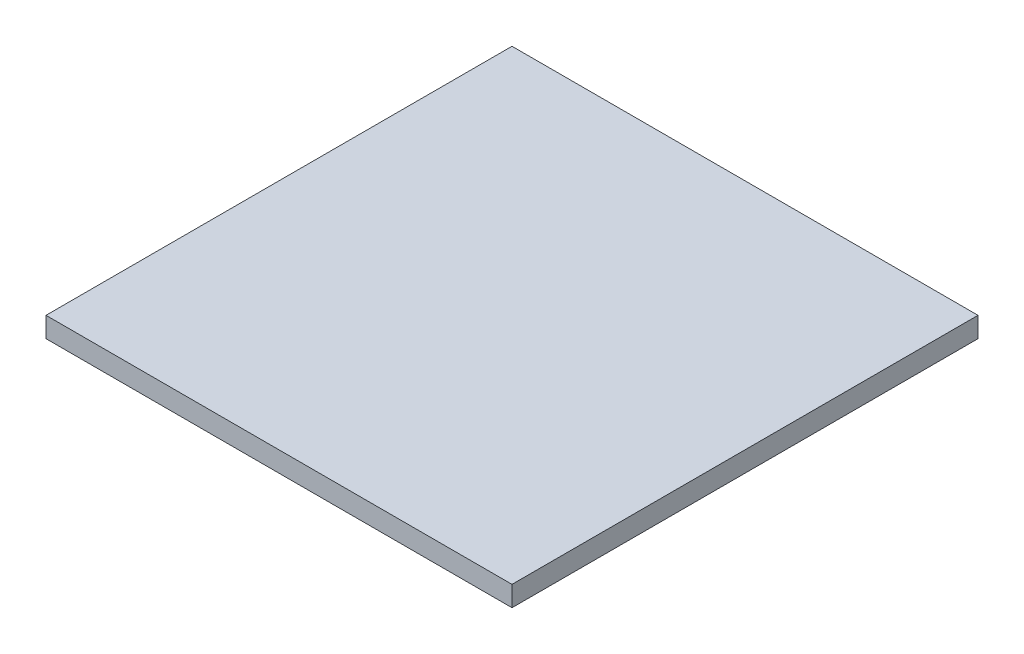
ISO-10303-21;
HEADER;
FILE_DESCRIPTION(('STEP AP214'),'2;1');
FILE_NAME('part.step','',(''),(''),'','','');
FILE_SCHEMA(('AUTOMOTIVE_DESIGN { 1 0 10303 214 1 1 1 1 }'));
ENDSEC;
DATA;
#1=APPLICATION_CONTEXT('core data for automotive mechanical design processes');
#2=APPLICATION_PROTOCOL_DEFINITION('international standard','automotive_design',2000,#1);
#3=PRODUCT_CONTEXT('',#1,'mechanical');
#4=PRODUCT('Part','Part','',(#3));
#5=PRODUCT_RELATED_PRODUCT_CATEGORY('part','',(#4));
#6=PRODUCT_DEFINITION_FORMATION('','',#4);
#7=PRODUCT_DEFINITION_CONTEXT('part definition',#1,'design');
#8=PRODUCT_DEFINITION('design','',#6,#7);
#9=PRODUCT_DEFINITION_SHAPE('','',#8);
#10=(LENGTH_UNIT() NAMED_UNIT(*) SI_UNIT(.MILLI.,.METRE.));
#11=(NAMED_UNIT(*) PLANE_ANGLE_UNIT() SI_UNIT($,.RADIAN.));
#12=(NAMED_UNIT(*) SI_UNIT($,.STERADIAN.) SOLID_ANGLE_UNIT());
#13=UNCERTAINTY_MEASURE_WITH_UNIT(LENGTH_MEASURE(1.E-05),#10,'distance_accuracy_value','');
#14=(GEOMETRIC_REPRESENTATION_CONTEXT(3) GLOBAL_UNCERTAINTY_ASSIGNED_CONTEXT((#13)) GLOBAL_UNIT_ASSIGNED_CONTEXT((#10,
#11,#12)) REPRESENTATION_CONTEXT('',''));
#15=CARTESIAN_POINT('',(0.,0.,0.));
#16=DIRECTION('',(0.,0.,1.));
#17=DIRECTION('',(1.,0.,0.));
#18=AXIS2_PLACEMENT_3D('',#15,#16,#17);
#19=CARTESIAN_POINT('',(46.0000000000001,4.,46.0000000000001));
#20=DIRECTION('',(-1.,0.,0.));
#21=DIRECTION('',(0.,0.,1.));
#22=AXIS2_PLACEMENT_3D('',#19,#20,#21);
#23=PLANE('',#22);
#24=DIRECTION('',(0.,0.,-1.));
#25=VECTOR('',#24,1.);
#26=CARTESIAN_POINT('',(46.0000000000001,0.,46.0000000000001));
#27=LINE('',#26,#25);
#28=CARTESIAN_POINT('',(46.0000000000001,0.,46.0000000000001));
#29=VERTEX_POINT('',#28);
#30=CARTESIAN_POINT('',(46.0000000000001,0.,-46.0000000000001));
#31=VERTEX_POINT('',#30);
#32=EDGE_CURVE('E105',#29,#31,#27,.T.);
#33=ORIENTED_EDGE('',*,*,#32,.T.);
#34=DIRECTION('',(0.,-1.,0.));
#35=VECTOR('',#34,1.);
#36=CARTESIAN_POINT('',(46.0000000000001,4.,-46.0000000000001));
#37=LINE('',#36,#35);
#38=CARTESIAN_POINT('',(46.0000000000001,4.,-46.0000000000001));
#39=VERTEX_POINT('',#38);
#40=EDGE_CURVE('E11',#39,#31,#37,.T.);
#41=ORIENTED_EDGE('',*,*,#40,.F.);
#42=DIRECTION('',(0.,0.,-1.));
#43=VECTOR('',#42,1.);
#44=CARTESIAN_POINT('',(46.0000000000001,4.,46.0000000000001));
#45=LINE('',#44,#43);
#46=CARTESIAN_POINT('',(46.0000000000001,4.,46.0000000000001));
#47=VERTEX_POINT('',#46);
#48=EDGE_CURVE('E89',#47,#39,#45,.T.);
#49=ORIENTED_EDGE('',*,*,#48,.F.);
#50=DIRECTION('',(0.,-1.,0.));
#51=VECTOR('',#50,1.);
#52=CARTESIAN_POINT('',(46.0000000000001,4.,46.0000000000001));
#53=LINE('',#52,#51);
#54=EDGE_CURVE('E101',#47,#29,#53,.T.);
#55=ORIENTED_EDGE('',*,*,#54,.T.);
#56=EDGE_LOOP('',(#33,#41,#49,#55));
#57=FACE_BOUND('',#56,.T.);
#58=ADVANCED_FACE('F37',(#57),#23,.F.);
#59=CARTESIAN_POINT('',(-46.0000000000001,4.,-46.0000000000001));
#60=DIRECTION('',(0.,0.,1.));
#61=DIRECTION('',(1.,0.,0.));
#62=AXIS2_PLACEMENT_3D('',#59,#60,#61);
#63=PLANE('',#62);
#64=DIRECTION('',(-1.,0.,0.));
#65=VECTOR('',#64,1.);
#66=CARTESIAN_POINT('',(-46.0000000000001,0.,-46.0000000000001));
#67=LINE('',#66,#65);
#68=CARTESIAN_POINT('',(-46.0000000000001,0.,-46.0000000000001));
#69=VERTEX_POINT('',#68);
#70=EDGE_CURVE('E94',#31,#69,#67,.T.);
#71=ORIENTED_EDGE('',*,*,#70,.T.);
#72=DIRECTION('',(0.,-1.,0.));
#73=VECTOR('',#72,1.);
#74=CARTESIAN_POINT('',(-46.0000000000001,4.,-46.0000000000001));
#75=LINE('',#74,#73);
#76=CARTESIAN_POINT('',(-46.0000000000001,4.,-46.0000000000001));
#77=VERTEX_POINT('',#76);
#78=EDGE_CURVE('E46',#77,#69,#75,.T.);
#79=ORIENTED_EDGE('',*,*,#78,.F.);
#80=DIRECTION('',(-1.,0.,0.));
#81=VECTOR('',#80,1.);
#82=CARTESIAN_POINT('',(-46.0000000000001,4.,-46.0000000000001));
#83=LINE('',#82,#81);
#84=EDGE_CURVE('E84',#39,#77,#83,.T.);
#85=ORIENTED_EDGE('',*,*,#84,.F.);
#86=ORIENTED_EDGE('',*,*,#40,.T.);
#87=EDGE_LOOP('',(#71,#79,#85,#86));
#88=FACE_BOUND('',#87,.T.);
#89=ADVANCED_FACE('F93',(#88),#63,.F.);
#90=CARTESIAN_POINT('',(-46.0000000000001,4.,46.0000000000001));
#91=DIRECTION('',(1.,0.,0.));
#92=DIRECTION('',(0.,0.,-1.));
#93=AXIS2_PLACEMENT_3D('',#90,#91,#92);
#94=PLANE('',#93);
#95=DIRECTION('',(0.,0.,1.));
#96=VECTOR('',#95,1.);
#97=CARTESIAN_POINT('',(-46.0000000000001,0.,46.0000000000001));
#98=LINE('',#97,#96);
#99=CARTESIAN_POINT('',(-46.0000000000001,0.,46.0000000000001));
#100=VERTEX_POINT('',#99);
#101=EDGE_CURVE('E71',#69,#100,#98,.T.);
#102=ORIENTED_EDGE('',*,*,#101,.T.);
#103=DIRECTION('',(0.,-1.,0.));
#104=VECTOR('',#103,1.);
#105=CARTESIAN_POINT('',(-46.0000000000001,4.,46.0000000000001));
#106=LINE('',#105,#104);
#107=CARTESIAN_POINT('',(-46.0000000000001,4.,46.0000000000001));
#108=VERTEX_POINT('',#107);
#109=EDGE_CURVE('E96',#108,#100,#106,.T.);
#110=ORIENTED_EDGE('',*,*,#109,.F.);
#111=DIRECTION('',(0.,0.,1.));
#112=VECTOR('',#111,1.);
#113=CARTESIAN_POINT('',(-46.0000000000001,4.,46.0000000000001));
#114=LINE('',#113,#112);
#115=EDGE_CURVE('E87',#77,#108,#114,.T.);
#116=ORIENTED_EDGE('',*,*,#115,.F.);
#117=ORIENTED_EDGE('',*,*,#78,.T.);
#118=EDGE_LOOP('',(#102,#110,#116,#117));
#119=FACE_BOUND('',#118,.T.);
#120=ADVANCED_FACE('F97',(#119),#94,.F.);
#121=CARTESIAN_POINT('',(-46.0000000000001,4.,46.0000000000001));
#122=DIRECTION('',(0.,0.,-1.));
#123=DIRECTION('',(-1.,0.,0.));
#124=AXIS2_PLACEMENT_3D('',#121,#122,#123);
#125=PLANE('',#124);
#126=DIRECTION('',(1.,0.,0.));
#127=VECTOR('',#126,1.);
#128=CARTESIAN_POINT('',(-46.0000000000001,0.,46.0000000000001));
#129=LINE('',#128,#127);
#130=EDGE_CURVE('E77',#100,#29,#129,.T.);
#131=ORIENTED_EDGE('',*,*,#130,.T.);
#132=ORIENTED_EDGE('',*,*,#54,.F.);
#133=DIRECTION('',(1.,0.,0.));
#134=VECTOR('',#133,1.);
#135=CARTESIAN_POINT('',(-46.0000000000001,4.,46.0000000000001));
#136=LINE('',#135,#134);
#137=EDGE_CURVE('E54',#108,#47,#136,.T.);
#138=ORIENTED_EDGE('',*,*,#137,.F.);
#139=ORIENTED_EDGE('',*,*,#109,.T.);
#140=EDGE_LOOP('',(#131,#132,#138,#139));
#141=FACE_BOUND('',#140,.T.);
#142=ADVANCED_FACE('F118',(#141),#125,.F.);
#143=CARTESIAN_POINT('',(0.,4.,0.));
#144=DIRECTION('',(0.,-1.,0.));
#145=DIRECTION('',(0.,0.,-1.));
#146=AXIS2_PLACEMENT_3D('',#143,#144,#145);
#147=PLANE('',#146);
#148=ORIENTED_EDGE('',*,*,#48,.T.);
#149=ORIENTED_EDGE('',*,*,#84,.T.);
#150=ORIENTED_EDGE('',*,*,#115,.T.);
#151=ORIENTED_EDGE('',*,*,#137,.T.);
#152=EDGE_LOOP('',(#148,#149,#150,#151));
#153=FACE_BOUND('',#152,.T.);
#154=ADVANCED_FACE('F85',(#153),#147,.F.);
#155=CARTESIAN_POINT('',(0.,0.,0.));
#156=DIRECTION('',(0.,-1.,0.));
#157=DIRECTION('',(0.,0.,-1.));
#158=AXIS2_PLACEMENT_3D('',#155,#156,#157);
#159=PLANE('',#158);
#160=ORIENTED_EDGE('',*,*,#32,.F.);
#161=ORIENTED_EDGE('',*,*,#130,.F.);
#162=ORIENTED_EDGE('',*,*,#101,.F.);
#163=ORIENTED_EDGE('',*,*,#70,.F.);
#164=EDGE_LOOP('',(#160,#161,#162,#163));
#165=FACE_BOUND('',#164,.T.);
#166=ADVANCED_FACE('F121',(#165),#159,.T.);
#167=CLOSED_SHELL('',(#58,#89,#120,#142,#154,#166));
#168=MANIFOLD_SOLID_BREP('B2',#167);
#169=ADVANCED_BREP_SHAPE_REPRESENTATION('',(#18,#168),#14);
#170=SHAPE_DEFINITION_REPRESENTATION(#9,#169);
ENDSEC;
END-ISO-10303-21;
